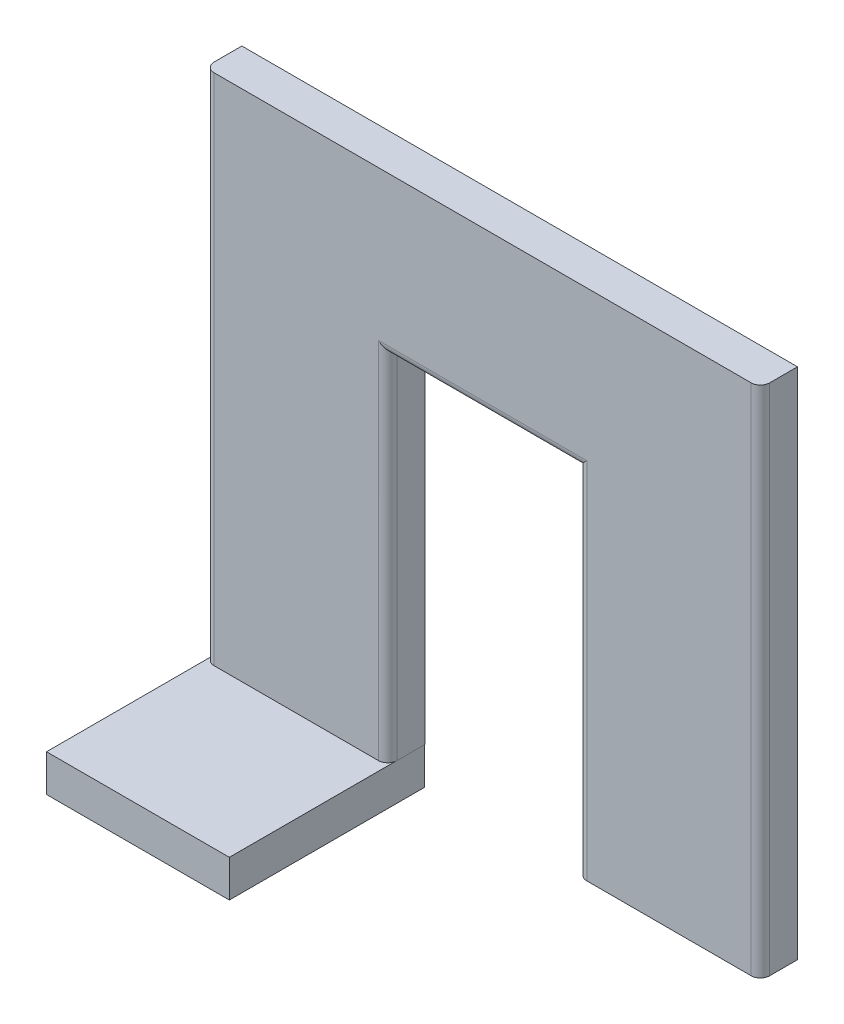
ISO-10303-21;
HEADER;
FILE_DESCRIPTION(('STEP AP214'),'2;1');
FILE_NAME('part.step','',(''),(''),'','','');
FILE_SCHEMA(('AUTOMOTIVE_DESIGN { 1 0 10303 214 1 1 1 1 }'));
ENDSEC;
DATA;
#1=APPLICATION_CONTEXT('core data for automotive mechanical design processes');
#2=APPLICATION_PROTOCOL_DEFINITION('international standard','automotive_design',2000,#1);
#3=PRODUCT_CONTEXT('',#1,'mechanical');
#4=PRODUCT('Part','Part','',(#3));
#5=PRODUCT_RELATED_PRODUCT_CATEGORY('part','',(#4));
#6=PRODUCT_DEFINITION_FORMATION('','',#4);
#7=PRODUCT_DEFINITION_CONTEXT('part definition',#1,'design');
#8=PRODUCT_DEFINITION('design','',#6,#7);
#9=PRODUCT_DEFINITION_SHAPE('','',#8);
#10=(LENGTH_UNIT() NAMED_UNIT(*) SI_UNIT(.MILLI.,.METRE.));
#11=(NAMED_UNIT(*) PLANE_ANGLE_UNIT() SI_UNIT($,.RADIAN.));
#12=(NAMED_UNIT(*) SI_UNIT($,.STERADIAN.) SOLID_ANGLE_UNIT());
#13=UNCERTAINTY_MEASURE_WITH_UNIT(LENGTH_MEASURE(1.E-05),#10,'distance_accuracy_value','');
#14=(GEOMETRIC_REPRESENTATION_CONTEXT(3) GLOBAL_UNCERTAINTY_ASSIGNED_CONTEXT((#13)) GLOBAL_UNIT_ASSIGNED_CONTEXT((#10,
#11,#12)) REPRESENTATION_CONTEXT('',''));
#15=CARTESIAN_POINT('',(0.,0.,0.));
#16=DIRECTION('',(0.,0.,1.));
#17=DIRECTION('',(1.,0.,0.));
#18=AXIS2_PLACEMENT_3D('',#15,#16,#17);
#19=CARTESIAN_POINT('',(-15.,-13.8636363636364,2.));
#20=DIRECTION('',(0.,1.,0.));
#21=DIRECTION('',(0.,0.,1.));
#22=AXIS2_PLACEMENT_3D('',#19,#20,#21);
#23=PLANE('',#22);
#24=DIRECTION('',(0.,0.,1.));
#25=VECTOR('',#24,1.);
#26=CARTESIAN_POINT('',(-5.1289948716134,-13.8636363636364,0.));
#27=LINE('',#26,#25);
#28=CARTESIAN_POINT('',(-5.1289948716134,-13.8636363636364,0.));
#29=VERTEX_POINT('',#28);
#30=CARTESIAN_POINT('',(-5.1289948716134,-13.8636363636364,1.56728288160896));
#31=VERTEX_POINT('',#30);
#32=EDGE_CURVE('E48',#29,#31,#27,.T.);
#33=ORIENTED_EDGE('',*,*,#32,.F.);
#34=DIRECTION('',(1.,0.,0.));
#35=VECTOR('',#34,1.);
#36=CARTESIAN_POINT('',(-15.,-13.8636363636364,0.));
#37=LINE('',#36,#35);
#38=CARTESIAN_POINT('',(-5.12444720417668,-13.8636363636364,0.));
#39=VERTEX_POINT('',#38);
#40=EDGE_CURVE('E207',#29,#39,#37,.T.);
#41=ORIENTED_EDGE('',*,*,#40,.T.);
#42=DIRECTION('',(0.,0.,1.));
#43=VECTOR('',#42,1.);
#44=CARTESIAN_POINT('',(-5.12444720417668,-13.8636363636364,2.));
#45=LINE('',#44,#43);
#46=CARTESIAN_POINT('',(-5.12444720417668,-13.8636363636364,1.5));
#47=VERTEX_POINT('',#46);
#48=EDGE_CURVE('E200',#39,#47,#45,.T.);
#49=ORIENTED_EDGE('',*,*,#48,.T.);
#50=CARTESIAN_POINT('',(-5.62444720417668,-13.8636363636364,1.5));
#51=DIRECTION('',(0.,1.,0.));
#52=DIRECTION('',(0.,0.,1.));
#53=AXIS2_PLACEMENT_3D('',#50,#51,#52);
#54=CIRCLE('',#53,0.5);
#55=EDGE_CURVE('E247',#47,#31,#54,.F.);
#56=ORIENTED_EDGE('',*,*,#55,.T.);
#57=EDGE_LOOP('',(#33,#41,#49,#56));
#58=FACE_BOUND('',#57,.T.);
#59=ADVANCED_FACE('F33',(#58),#23,.F.);
#60=CARTESIAN_POINT('',(15.,-13.8636363636364,2.));
#61=DIRECTION('',(-1.,0.,0.));
#62=DIRECTION('',(0.,0.,1.));
#63=AXIS2_PLACEMENT_3D('',#60,#61,#62);
#64=PLANE('',#63);
#65=DIRECTION('',(0.,0.,-1.));
#66=VECTOR('',#65,1.);
#67=CARTESIAN_POINT('',(15.,13.8636363636364,2.));
#68=LINE('',#67,#66);
#69=CARTESIAN_POINT('',(15.,13.8636363636364,1.5));
#70=VERTEX_POINT('',#69);
#71=CARTESIAN_POINT('',(15.,13.8636363636364,0.));
#72=VERTEX_POINT('',#71);
#73=EDGE_CURVE('E218',#70,#72,#68,.T.);
#74=ORIENTED_EDGE('',*,*,#73,.F.);
#75=DIRECTION('',(0.,1.,0.));
#76=VECTOR('',#75,1.);
#77=CARTESIAN_POINT('',(15.,-13.8636363636364,1.5));
#78=LINE('',#77,#76);
#79=CARTESIAN_POINT('',(15.,-13.8636363636364,1.5));
#80=VERTEX_POINT('',#79);
#81=EDGE_CURVE('E239',#70,#80,#78,.F.);
#82=ORIENTED_EDGE('',*,*,#81,.T.);
#83=DIRECTION('',(0.,0.,-1.));
#84=VECTOR('',#83,1.);
#85=CARTESIAN_POINT('',(15.,-13.8636363636364,2.));
#86=LINE('',#85,#84);
#87=CARTESIAN_POINT('',(15.,-13.8636363636364,0.));
#88=VERTEX_POINT('',#87);
#89=EDGE_CURVE('E211',#80,#88,#86,.T.);
#90=ORIENTED_EDGE('',*,*,#89,.T.);
#91=DIRECTION('',(0.,1.,0.));
#92=VECTOR('',#91,1.);
#93=CARTESIAN_POINT('',(15.,-13.8636363636364,0.));
#94=LINE('',#93,#92);
#95=EDGE_CURVE('E203',#88,#72,#94,.T.);
#96=ORIENTED_EDGE('',*,*,#95,.T.);
#97=EDGE_LOOP('',(#74,#82,#90,#96));
#98=FACE_BOUND('',#97,.T.);
#99=ADVANCED_FACE('F295',(#98),#64,.F.);
#100=CARTESIAN_POINT('',(-15.,13.8636363636364,2.));
#101=DIRECTION('',(0.,-1.,0.));
#102=DIRECTION('',(0.,0.,-1.));
#103=AXIS2_PLACEMENT_3D('',#100,#101,#102);
#104=PLANE('',#103);
#105=DIRECTION('',(-1.,0.,0.));
#106=VECTOR('',#105,1.);
#107=CARTESIAN_POINT('',(-15.,13.8636363636364,2.));
#108=LINE('',#107,#106);
#109=CARTESIAN_POINT('',(14.5,13.8636363636364,2.));
#110=VERTEX_POINT('',#109);
#111=CARTESIAN_POINT('',(-14.5,13.8636363636364,2.));
#112=VERTEX_POINT('',#111);
#113=EDGE_CURVE('E204',#110,#112,#108,.T.);
#114=ORIENTED_EDGE('',*,*,#113,.F.);
#115=CARTESIAN_POINT('',(14.5,13.8636363636364,1.5));
#116=DIRECTION('',(0.,-1.,0.));
#117=DIRECTION('',(0.,0.,-1.));
#118=AXIS2_PLACEMENT_3D('',#115,#116,#117);
#119=CIRCLE('',#118,0.5);
#120=EDGE_CURVE('E237',#110,#70,#119,.F.);
#121=ORIENTED_EDGE('',*,*,#120,.T.);
#122=ORIENTED_EDGE('',*,*,#73,.T.);
#123=DIRECTION('',(-1.,0.,0.));
#124=VECTOR('',#123,1.);
#125=CARTESIAN_POINT('',(-15.,13.8636363636364,0.));
#126=LINE('',#125,#124);
#127=CARTESIAN_POINT('',(-15.,13.8636363636364,0.));
#128=VERTEX_POINT('',#127);
#129=EDGE_CURVE('E154',#72,#128,#126,.T.);
#130=ORIENTED_EDGE('',*,*,#129,.T.);
#131=DIRECTION('',(0.,0.,-1.));
#132=VECTOR('',#131,1.);
#133=CARTESIAN_POINT('',(-15.,13.8636363636364,2.));
#134=LINE('',#133,#132);
#135=CARTESIAN_POINT('',(-15.,13.8636363636364,1.5));
#136=VERTEX_POINT('',#135);
#137=EDGE_CURVE('E149',#136,#128,#134,.T.);
#138=ORIENTED_EDGE('',*,*,#137,.F.);
#139=CARTESIAN_POINT('',(-14.5,13.8636363636364,1.5));
#140=DIRECTION('',(0.,-1.,0.));
#141=DIRECTION('',(0.,0.,-1.));
#142=AXIS2_PLACEMENT_3D('',#139,#140,#141);
#143=CIRCLE('',#142,0.5);
#144=EDGE_CURVE('E231',#136,#112,#143,.F.);
#145=ORIENTED_EDGE('',*,*,#144,.T.);
#146=EDGE_LOOP('',(#114,#121,#122,#130,#138,#145));
#147=FACE_BOUND('',#146,.T.);
#148=ADVANCED_FACE('F290',(#147),#104,.F.);
#149=CARTESIAN_POINT('',(-15.,-13.8636363636364,2.));
#150=DIRECTION('',(1.,0.,0.));
#151=DIRECTION('',(0.,0.,-1.));
#152=AXIS2_PLACEMENT_3D('',#149,#150,#151);
#153=PLANE('',#152);
#154=DIRECTION('',(0.,-1.,0.));
#155=VECTOR('',#154,1.);
#156=CARTESIAN_POINT('',(-15.,-13.8636363636364,0.));
#157=LINE('',#156,#155);
#158=CARTESIAN_POINT('',(-15.,-15.8636363636364,0.));
#159=VERTEX_POINT('',#158);
#160=EDGE_CURVE('E142',#128,#159,#157,.T.);
#161=ORIENTED_EDGE('',*,*,#160,.T.);
#162=DIRECTION('',(0.,0.,-1.));
#163=VECTOR('',#162,1.);
#164=CARTESIAN_POINT('',(-15.,-15.8636363636364,0.));
#165=LINE('',#164,#163);
#166=CARTESIAN_POINT('',(-15.,-15.8636363636364,10.5465485190999));
#167=VERTEX_POINT('',#166);
#168=EDGE_CURVE('E147',#167,#159,#165,.T.);
#169=ORIENTED_EDGE('',*,*,#168,.F.);
#170=DIRECTION('',(0.,1.,0.));
#171=VECTOR('',#170,1.);
#172=CARTESIAN_POINT('',(-15.,-15.8636363636364,10.5465485190999));
#173=LINE('',#172,#171);
#174=CARTESIAN_POINT('',(-15.,-13.8636363636364,10.5465485190999));
#175=VERTEX_POINT('',#174);
#176=EDGE_CURVE('E176',#167,#175,#173,.T.);
#177=ORIENTED_EDGE('',*,*,#176,.T.);
#178=DIRECTION('',(0.,0.,-1.));
#179=VECTOR('',#178,1.);
#180=CARTESIAN_POINT('',(-15.,-13.8636363636364,0.));
#181=LINE('',#180,#179);
#182=CARTESIAN_POINT('',(-15.,-13.8636363636364,1.5));
#183=VERTEX_POINT('',#182);
#184=EDGE_CURVE('E177',#175,#183,#181,.T.);
#185=ORIENTED_EDGE('',*,*,#184,.T.);
#186=DIRECTION('',(0.,-1.,0.));
#187=VECTOR('',#186,1.);
#188=CARTESIAN_POINT('',(-15.,-13.8636363636364,1.5));
#189=LINE('',#188,#187);
#190=EDGE_CURVE('E229',#183,#136,#189,.F.);
#191=ORIENTED_EDGE('',*,*,#190,.T.);
#192=ORIENTED_EDGE('',*,*,#137,.T.);
#193=EDGE_LOOP('',(#161,#169,#177,#185,#191,#192));
#194=FACE_BOUND('',#193,.T.);
#195=ADVANCED_FACE('F144',(#194),#153,.F.);
#196=DIRECTION('',(1.,0.,0.));
#197=VECTOR('',#196,1.);
#198=CARTESIAN_POINT('',(-15.,-13.8636363636364,2.));
#199=LINE('',#198,#197);
#200=CARTESIAN_POINT('',(5.62444720417668,-13.8636363636364,2.));
#201=VERTEX_POINT('',#200);
#202=CARTESIAN_POINT('',(14.5,-13.8636363636364,2.));
#203=VERTEX_POINT('',#202);
#204=EDGE_CURVE('E206',#201,#203,#199,.T.);
#205=ORIENTED_EDGE('',*,*,#204,.F.);
#206=CARTESIAN_POINT('',(5.62444720417668,-13.8636363636364,1.5));
#207=DIRECTION('',(0.,1.,0.));
#208=DIRECTION('',(0.,0.,1.));
#209=AXIS2_PLACEMENT_3D('',#206,#207,#208);
#210=CIRCLE('',#209,0.5);
#211=CARTESIAN_POINT('',(5.12444720417668,-13.8636363636364,1.5));
#212=VERTEX_POINT('',#211);
#213=EDGE_CURVE('E256',#201,#212,#210,.F.);
#214=ORIENTED_EDGE('',*,*,#213,.T.);
#215=DIRECTION('',(0.,0.,-1.));
#216=VECTOR('',#215,1.);
#217=CARTESIAN_POINT('',(5.12444720417668,-13.8636363636364,2.));
#218=LINE('',#217,#216);
#219=CARTESIAN_POINT('',(5.12444720417668,-13.8636363636364,0.));
#220=VERTEX_POINT('',#219);
#221=EDGE_CURVE('E196',#212,#220,#218,.T.);
#222=ORIENTED_EDGE('',*,*,#221,.T.);
#223=EDGE_CURVE('E153',#220,#88,#37,.T.);
#224=ORIENTED_EDGE('',*,*,#223,.T.);
#225=ORIENTED_EDGE('',*,*,#89,.F.);
#226=CARTESIAN_POINT('',(14.5,-13.8636363636364,1.5));
#227=DIRECTION('',(0.,1.,0.));
#228=DIRECTION('',(0.,0.,1.));
#229=AXIS2_PLACEMENT_3D('',#226,#227,#228);
#230=CIRCLE('',#229,0.5);
#231=EDGE_CURVE('E241',#80,#203,#230,.F.);
#232=ORIENTED_EDGE('',*,*,#231,.T.);
#233=EDGE_LOOP('',(#205,#214,#222,#224,#225,#232));
#234=FACE_BOUND('',#233,.T.);
#235=ADVANCED_FACE('F301',(#234),#23,.F.);
#236=CARTESIAN_POINT('',(0.,0.,2.));
#237=DIRECTION('',(0.,0.,-1.));
#238=DIRECTION('',(-1.,0.,0.));
#239=AXIS2_PLACEMENT_3D('',#236,#237,#238);
#240=PLANE('',#239);
#241=DIRECTION('',(0.,-1.,0.));
#242=VECTOR('',#241,1.);
#243=CARTESIAN_POINT('',(-5.62444720417668,0.,2.));
#244=LINE('',#243,#242);
#245=CARTESIAN_POINT('',(-5.62444720417668,-13.8636363636364,2.));
#246=VERTEX_POINT('',#245);
#247=CARTESIAN_POINT('',(-5.62444720417668,5.78374063718961,2.));
#248=VERTEX_POINT('',#247);
#249=EDGE_CURVE('E249',#246,#248,#244,.F.);
#250=ORIENTED_EDGE('',*,*,#249,.T.);
#251=DIRECTION('',(-1.,0.,0.));
#252=VECTOR('',#251,1.);
#253=CARTESIAN_POINT('',(0.,5.78374063718961,2.));
#254=LINE('',#253,#252);
#255=CARTESIAN_POINT('',(5.62444720417668,5.78374063718961,2.));
#256=VERTEX_POINT('',#255);
#257=EDGE_CURVE('E261',#248,#256,#254,.F.);
#258=ORIENTED_EDGE('',*,*,#257,.T.);
#259=DIRECTION('',(0.,1.,0.));
#260=VECTOR('',#259,1.);
#261=CARTESIAN_POINT('',(5.62444720417668,0.,2.));
#262=LINE('',#261,#260);
#263=EDGE_CURVE('E254',#256,#201,#262,.F.);
#264=ORIENTED_EDGE('',*,*,#263,.T.);
#265=ORIENTED_EDGE('',*,*,#204,.T.);
#266=DIRECTION('',(0.,1.,0.));
#267=VECTOR('',#266,1.);
#268=CARTESIAN_POINT('',(14.5,0.,2.));
#269=LINE('',#268,#267);
#270=EDGE_CURVE('E234',#203,#110,#269,.T.);
#271=ORIENTED_EDGE('',*,*,#270,.T.);
#272=ORIENTED_EDGE('',*,*,#113,.T.);
#273=DIRECTION('',(0.,-1.,0.));
#274=VECTOR('',#273,1.);
#275=CARTESIAN_POINT('',(-14.5,0.,2.));
#276=LINE('',#275,#274);
#277=CARTESIAN_POINT('',(-14.5,-13.8636363636364,2.));
#278=VERTEX_POINT('',#277);
#279=EDGE_CURVE('E223',#112,#278,#276,.T.);
#280=ORIENTED_EDGE('',*,*,#279,.T.);
#281=EDGE_CURVE('E208',#278,#246,#199,.T.);
#282=ORIENTED_EDGE('',*,*,#281,.T.);
#283=EDGE_LOOP('',(#250,#258,#264,#265,#271,#272,#280,#282));
#284=FACE_BOUND('',#283,.T.);
#285=ADVANCED_FACE('F271',(#284),#240,.F.);
#286=CARTESIAN_POINT('',(0.,0.,0.));
#287=DIRECTION('',(0.,0.,-1.));
#288=DIRECTION('',(-1.,0.,0.));
#289=AXIS2_PLACEMENT_3D('',#286,#287,#288);
#290=PLANE('',#289);
#291=DIRECTION('',(0.,-1.,0.));
#292=VECTOR('',#291,1.);
#293=CARTESIAN_POINT('',(-5.12444720417668,-13.8722928339697,0.));
#294=LINE('',#293,#292);
#295=CARTESIAN_POINT('',(-5.12444720417668,5.28374063718961,0.));
#296=VERTEX_POINT('',#295);
#297=EDGE_CURVE('E187',#296,#39,#294,.T.);
#298=ORIENTED_EDGE('',*,*,#297,.T.);
#299=ORIENTED_EDGE('',*,*,#40,.F.);
#300=DIRECTION('',(0.,1.,0.));
#301=VECTOR('',#300,1.);
#302=CARTESIAN_POINT('',(-5.1289948716134,-15.8636363636364,0.));
#303=LINE('',#302,#301);
#304=CARTESIAN_POINT('',(-5.1289948716134,-15.8636363636364,0.));
#305=VERTEX_POINT('',#304);
#306=EDGE_CURVE('E161',#305,#29,#303,.T.);
#307=ORIENTED_EDGE('',*,*,#306,.F.);
#308=DIRECTION('',(1.,0.,0.));
#309=VECTOR('',#308,1.);
#310=CARTESIAN_POINT('',(-15.,-15.8636363636364,0.));
#311=LINE('',#310,#309);
#312=EDGE_CURVE('E157',#159,#305,#311,.T.);
#313=ORIENTED_EDGE('',*,*,#312,.F.);
#314=ORIENTED_EDGE('',*,*,#160,.F.);
#315=ORIENTED_EDGE('',*,*,#129,.F.);
#316=ORIENTED_EDGE('',*,*,#95,.F.);
#317=ORIENTED_EDGE('',*,*,#223,.F.);
#318=DIRECTION('',(0.,-1.,0.));
#319=VECTOR('',#318,1.);
#320=CARTESIAN_POINT('',(5.12444720417668,0.,0.));
#321=LINE('',#320,#319);
#322=CARTESIAN_POINT('',(5.12444720417668,5.28374063718961,0.));
#323=VERTEX_POINT('',#322);
#324=EDGE_CURVE('E220',#323,#220,#321,.T.);
#325=ORIENTED_EDGE('',*,*,#324,.F.);
#326=DIRECTION('',(-1.,0.,0.));
#327=VECTOR('',#326,1.);
#328=CARTESIAN_POINT('',(5.12444720417668,5.28374063718961,0.));
#329=LINE('',#328,#327);
#330=EDGE_CURVE('E189',#323,#296,#329,.T.);
#331=ORIENTED_EDGE('',*,*,#330,.T.);
#332=EDGE_LOOP('',(#298,#299,#307,#313,#314,#315,#316,#317,#325,#331));
#333=FACE_BOUND('',#332,.T.);
#334=ADVANCED_FACE('F159',(#333),#290,.T.);
#335=CARTESIAN_POINT('',(-5.12444720417668,-13.8722928339697,0.));
#336=DIRECTION('',(-1.,0.,0.));
#337=DIRECTION('',(0.,0.,1.));
#338=AXIS2_PLACEMENT_3D('',#335,#336,#337);
#339=PLANE('',#338);
#340=DIRECTION('',(0.,0.,1.));
#341=VECTOR('',#340,1.);
#342=CARTESIAN_POINT('',(-5.12444720417668,5.28374063718961,0.));
#343=LINE('',#342,#341);
#344=CARTESIAN_POINT('',(-5.12444720417668,5.28374063718961,1.5));
#345=VERTEX_POINT('',#344);
#346=EDGE_CURVE('E193',#296,#345,#343,.T.);
#347=ORIENTED_EDGE('',*,*,#346,.T.);
#348=DIRECTION('',(0.,-1.,0.));
#349=VECTOR('',#348,1.);
#350=CARTESIAN_POINT('',(-5.12444720417668,-13.8722928339697,1.5));
#351=LINE('',#350,#349);
#352=EDGE_CURVE('E244',#345,#47,#351,.T.);
#353=ORIENTED_EDGE('',*,*,#352,.T.);
#354=ORIENTED_EDGE('',*,*,#48,.F.);
#355=ORIENTED_EDGE('',*,*,#297,.F.);
#356=EDGE_LOOP('',(#347,#353,#354,#355));
#357=FACE_BOUND('',#356,.T.);
#358=ADVANCED_FACE('F313',(#357),#339,.F.);
#359=CARTESIAN_POINT('',(5.12444720417668,-13.8722928339697,0.));
#360=DIRECTION('',(1.,0.,0.));
#361=DIRECTION('',(0.,0.,-1.));
#362=AXIS2_PLACEMENT_3D('',#359,#360,#361);
#363=PLANE('',#362);
#364=ORIENTED_EDGE('',*,*,#221,.F.);
#365=DIRECTION('',(0.,1.,0.));
#366=VECTOR('',#365,1.);
#367=CARTESIAN_POINT('',(5.12444720417668,-13.8722928339697,1.5));
#368=LINE('',#367,#366);
#369=CARTESIAN_POINT('',(5.12444720417668,5.28374063718961,1.5));
#370=VERTEX_POINT('',#369);
#371=EDGE_CURVE('E251',#212,#370,#368,.T.);
#372=ORIENTED_EDGE('',*,*,#371,.T.);
#373=DIRECTION('',(0.,0.,1.));
#374=VECTOR('',#373,1.);
#375=CARTESIAN_POINT('',(5.12444720417668,5.28374063718961,0.));
#376=LINE('',#375,#374);
#377=EDGE_CURVE('E192',#323,#370,#376,.T.);
#378=ORIENTED_EDGE('',*,*,#377,.F.);
#379=ORIENTED_EDGE('',*,*,#324,.T.);
#380=EDGE_LOOP('',(#364,#372,#378,#379));
#381=FACE_BOUND('',#380,.T.);
#382=ADVANCED_FACE('F306',(#381),#363,.F.);
#383=CARTESIAN_POINT('',(5.12444720417668,5.28374063718961,0.));
#384=DIRECTION('',(0.,1.,0.));
#385=DIRECTION('',(-1.,0.,0.));
#386=AXIS2_PLACEMENT_3D('',#383,#384,#385);
#387=PLANE('',#386);
#388=ORIENTED_EDGE('',*,*,#377,.T.);
#389=DIRECTION('',(-1.,0.,0.));
#390=VECTOR('',#389,1.);
#391=CARTESIAN_POINT('',(5.12444720417668,5.28374063718961,1.5));
#392=LINE('',#391,#390);
#393=EDGE_CURVE('E258',#370,#345,#392,.T.);
#394=ORIENTED_EDGE('',*,*,#393,.T.);
#395=ORIENTED_EDGE('',*,*,#346,.F.);
#396=ORIENTED_EDGE('',*,*,#330,.F.);
#397=EDGE_LOOP('',(#388,#394,#395,#396));
#398=FACE_BOUND('',#397,.T.);
#399=ADVANCED_FACE('F309',(#398),#387,.F.);
#400=CARTESIAN_POINT('',(-14.5,0.,1.5));
#401=DIRECTION('',(0.,-1.,0.));
#402=DIRECTION('',(0.,0.,-1.));
#403=AXIS2_PLACEMENT_3D('',#400,#401,#402);
#404=CYLINDRICAL_SURFACE('',#403,0.5);
#405=ORIENTED_EDGE('',*,*,#144,.F.);
#406=ORIENTED_EDGE('',*,*,#190,.F.);
#407=CARTESIAN_POINT('',(-14.5,-13.8636363636364,1.5));
#408=DIRECTION('',(0.,1.,0.));
#409=DIRECTION('',(0.,0.,1.));
#410=AXIS2_PLACEMENT_3D('',#407,#408,#409);
#411=CIRCLE('',#410,0.5);
#412=EDGE_CURVE('E226',#278,#183,#411,.F.);
#413=ORIENTED_EDGE('',*,*,#412,.F.);
#414=ORIENTED_EDGE('',*,*,#279,.F.);
#415=EDGE_LOOP('',(#405,#406,#413,#414));
#416=FACE_BOUND('',#415,.T.);
#417=ADVANCED_FACE('F287',(#416),#404,.T.);
#418=CARTESIAN_POINT('',(14.5,0.,1.5));
#419=DIRECTION('',(0.,1.,0.));
#420=DIRECTION('',(0.,0.,1.));
#421=AXIS2_PLACEMENT_3D('',#418,#419,#420);
#422=CYLINDRICAL_SURFACE('',#421,0.5);
#423=ORIENTED_EDGE('',*,*,#231,.F.);
#424=ORIENTED_EDGE('',*,*,#81,.F.);
#425=ORIENTED_EDGE('',*,*,#120,.F.);
#426=ORIENTED_EDGE('',*,*,#270,.F.);
#427=EDGE_LOOP('',(#423,#424,#425,#426));
#428=FACE_BOUND('',#427,.T.);
#429=ADVANCED_FACE('F339',(#428),#422,.T.);
#430=CARTESIAN_POINT('',(-5.62444720417668,-13.8722928339697,1.5));
#431=DIRECTION('',(0.,-1.,0.));
#432=DIRECTION('',(0.,0.,-1.));
#433=AXIS2_PLACEMENT_3D('',#430,#431,#432);
#434=CYLINDRICAL_SURFACE('',#433,0.5);
#435=ORIENTED_EDGE('',*,*,#352,.F.);
#436=CARTESIAN_POINT('',(-5.62444720417668,5.78374063718961,1.5));
#437=DIRECTION('',(-0.707106781186547,-0.707106781186547,0.));
#438=DIRECTION('',(-0.707106781186548,0.707106781186547,0.));
#439=AXIS2_PLACEMENT_3D('',#436,#437,#438);
#440=ELLIPSE('',#439,0.707106781186547,0.5);
#441=EDGE_CURVE('E41',#345,#248,#440,.T.);
#442=ORIENTED_EDGE('',*,*,#441,.T.);
#443=ORIENTED_EDGE('',*,*,#249,.F.);
#444=EDGE_CURVE('E56',#31,#246,#54,.F.);
#445=ORIENTED_EDGE('',*,*,#444,.F.);
#446=ORIENTED_EDGE('',*,*,#55,.F.);
#447=EDGE_LOOP('',(#435,#442,#443,#445,#446));
#448=FACE_BOUND('',#447,.T.);
#449=ADVANCED_FACE('F266',(#448),#434,.T.);
#450=CARTESIAN_POINT('',(5.62444720417668,-13.8722928339697,1.5));
#451=DIRECTION('',(0.,1.,0.));
#452=DIRECTION('',(0.,0.,1.));
#453=AXIS2_PLACEMENT_3D('',#450,#451,#452);
#454=CYLINDRICAL_SURFACE('',#453,0.5);
#455=ORIENTED_EDGE('',*,*,#213,.F.);
#456=ORIENTED_EDGE('',*,*,#263,.F.);
#457=CARTESIAN_POINT('',(5.62444720417668,5.78374063718961,1.5));
#458=DIRECTION('',(-0.707106781186548,0.707106781186547,0.));
#459=DIRECTION('',(-0.707106781186547,-0.707106781186547,0.));
#460=AXIS2_PLACEMENT_3D('',#457,#458,#459);
#461=ELLIPSE('',#460,0.707106781186548,0.5);
#462=EDGE_CURVE('E11',#256,#370,#461,.F.);
#463=ORIENTED_EDGE('',*,*,#462,.T.);
#464=ORIENTED_EDGE('',*,*,#371,.F.);
#465=EDGE_LOOP('',(#455,#456,#463,#464));
#466=FACE_BOUND('',#465,.T.);
#467=ADVANCED_FACE('F344',(#466),#454,.T.);
#468=CARTESIAN_POINT('',(5.12444720417668,5.78374063718961,1.5));
#469=DIRECTION('',(-1.,0.,0.));
#470=DIRECTION('',(0.,-1.,0.));
#471=AXIS2_PLACEMENT_3D('',#468,#469,#470);
#472=CYLINDRICAL_SURFACE('',#471,0.5);
#473=ORIENTED_EDGE('',*,*,#462,.F.);
#474=ORIENTED_EDGE('',*,*,#257,.F.);
#475=ORIENTED_EDGE('',*,*,#441,.F.);
#476=ORIENTED_EDGE('',*,*,#393,.F.);
#477=EDGE_LOOP('',(#473,#474,#475,#476));
#478=FACE_BOUND('',#477,.T.);
#479=ADVANCED_FACE('F35',(#478),#472,.T.);
#480=CARTESIAN_POINT('',(-5.1289948716134,-15.8636363636364,0.));
#481=DIRECTION('',(-1.,0.,0.));
#482=DIRECTION('',(0.,0.,1.));
#483=AXIS2_PLACEMENT_3D('',#480,#481,#482);
#484=PLANE('',#483);
#485=ORIENTED_EDGE('',*,*,#32,.T.);
#486=CARTESIAN_POINT('',(-5.1289948716134,-13.8636363636364,10.5465485190999));
#487=VERTEX_POINT('',#486);
#488=EDGE_CURVE('E180',#31,#487,#27,.T.);
#489=ORIENTED_EDGE('',*,*,#488,.T.);
#490=DIRECTION('',(0.,1.,0.));
#491=VECTOR('',#490,1.);
#492=CARTESIAN_POINT('',(-5.1289948716134,-15.8636363636364,10.5465485190999));
#493=LINE('',#492,#491);
#494=CARTESIAN_POINT('',(-5.1289948716134,-15.8636363636364,10.5465485190999));
#495=VERTEX_POINT('',#494);
#496=EDGE_CURVE('E183',#495,#487,#493,.T.);
#497=ORIENTED_EDGE('',*,*,#496,.F.);
#498=DIRECTION('',(0.,0.,1.));
#499=VECTOR('',#498,1.);
#500=CARTESIAN_POINT('',(-5.1289948716134,-15.8636363636364,0.));
#501=LINE('',#500,#499);
#502=EDGE_CURVE('E164',#305,#495,#501,.T.);
#503=ORIENTED_EDGE('',*,*,#502,.F.);
#504=ORIENTED_EDGE('',*,*,#306,.T.);
#505=EDGE_LOOP('',(#485,#489,#497,#503,#504));
#506=FACE_BOUND('',#505,.T.);
#507=ADVANCED_FACE('F282',(#506),#484,.F.);
#508=CARTESIAN_POINT('',(-15.,-15.8636363636364,10.5465485190999));
#509=DIRECTION('',(0.,0.,-1.));
#510=DIRECTION('',(-1.,0.,0.));
#511=AXIS2_PLACEMENT_3D('',#508,#509,#510);
#512=PLANE('',#511);
#513=DIRECTION('',(-1.,0.,0.));
#514=VECTOR('',#513,1.);
#515=CARTESIAN_POINT('',(-15.,-13.8636363636364,10.5465485190999));
#516=LINE('',#515,#514);
#517=EDGE_CURVE('E170',#487,#175,#516,.T.);
#518=ORIENTED_EDGE('',*,*,#517,.T.);
#519=ORIENTED_EDGE('',*,*,#176,.F.);
#520=DIRECTION('',(-1.,0.,0.));
#521=VECTOR('',#520,1.);
#522=CARTESIAN_POINT('',(-15.,-15.8636363636364,10.5465485190999));
#523=LINE('',#522,#521);
#524=EDGE_CURVE('E168',#495,#167,#523,.T.);
#525=ORIENTED_EDGE('',*,*,#524,.F.);
#526=ORIENTED_EDGE('',*,*,#496,.T.);
#527=EDGE_LOOP('',(#518,#519,#525,#526));
#528=FACE_BOUND('',#527,.T.);
#529=ADVANCED_FACE('F284',(#528),#512,.F.);
#530=CARTESIAN_POINT('',(0.,-15.8636363636364,0.));
#531=DIRECTION('',(0.,1.,0.));
#532=DIRECTION('',(0.,0.,1.));
#533=AXIS2_PLACEMENT_3D('',#530,#531,#532);
#534=PLANE('',#533);
#535=ORIENTED_EDGE('',*,*,#168,.T.);
#536=ORIENTED_EDGE('',*,*,#312,.T.);
#537=ORIENTED_EDGE('',*,*,#502,.T.);
#538=ORIENTED_EDGE('',*,*,#524,.T.);
#539=EDGE_LOOP('',(#535,#536,#537,#538));
#540=FACE_BOUND('',#539,.T.);
#541=ADVANCED_FACE('F166',(#540),#534,.F.);
#542=CARTESIAN_POINT('',(0.,-13.8636363636364,0.));
#543=DIRECTION('',(0.,1.,0.));
#544=DIRECTION('',(0.,0.,1.));
#545=AXIS2_PLACEMENT_3D('',#542,#543,#544);
#546=PLANE('',#545);
#547=ORIENTED_EDGE('',*,*,#281,.F.);
#548=ORIENTED_EDGE('',*,*,#412,.T.);
#549=ORIENTED_EDGE('',*,*,#184,.F.);
#550=ORIENTED_EDGE('',*,*,#517,.F.);
#551=ORIENTED_EDGE('',*,*,#488,.F.);
#552=ORIENTED_EDGE('',*,*,#444,.T.);
#553=EDGE_LOOP('',(#547,#548,#549,#550,#551,#552));
#554=FACE_BOUND('',#553,.T.);
#555=ADVANCED_FACE('F277',(#554),#546,.T.);
#556=CLOSED_SHELL('',(#59,#99,#148,#195,#235,#285,#334,#358,#382,#399,#417,#429,#449,#467,#479,
#507,#529,#541,#555));
#557=MANIFOLD_SOLID_BREP('B2',#556);
#558=ADVANCED_BREP_SHAPE_REPRESENTATION('',(#18,#557),#14);
#559=SHAPE_DEFINITION_REPRESENTATION(#9,#558);
ENDSEC;
END-ISO-10303-21;
